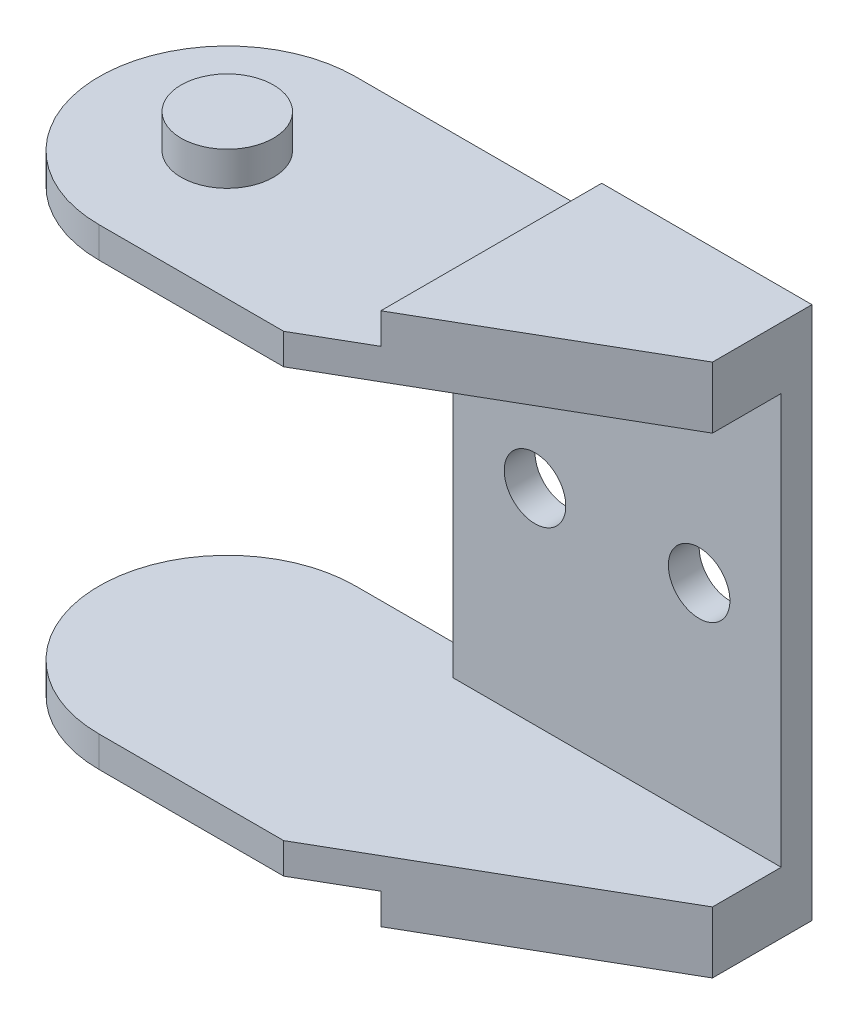
ISO-10303-21;
HEADER;
FILE_DESCRIPTION(('STEP AP214'),'2;1');
FILE_NAME('part.step','',(''),(''),'','','');
FILE_SCHEMA(('AUTOMOTIVE_DESIGN { 1 0 10303 214 1 1 1 1 }'));
ENDSEC;
DATA;
#1=APPLICATION_CONTEXT('core data for automotive mechanical design processes');
#2=APPLICATION_PROTOCOL_DEFINITION('international standard','automotive_design',2000,#1);
#3=PRODUCT_CONTEXT('',#1,'mechanical');
#4=PRODUCT('Part','Part','',(#3));
#5=PRODUCT_RELATED_PRODUCT_CATEGORY('part','',(#4));
#6=PRODUCT_DEFINITION_FORMATION('','',#4);
#7=PRODUCT_DEFINITION_CONTEXT('part definition',#1,'design');
#8=PRODUCT_DEFINITION('design','',#6,#7);
#9=PRODUCT_DEFINITION_SHAPE('','',#8);
#10=(LENGTH_UNIT() NAMED_UNIT(*) SI_UNIT(.MILLI.,.METRE.));
#11=(NAMED_UNIT(*) PLANE_ANGLE_UNIT() SI_UNIT($,.RADIAN.));
#12=(NAMED_UNIT(*) SI_UNIT($,.STERADIAN.) SOLID_ANGLE_UNIT());
#13=UNCERTAINTY_MEASURE_WITH_UNIT(LENGTH_MEASURE(1.E-05),#10,'distance_accuracy_value','');
#14=(GEOMETRIC_REPRESENTATION_CONTEXT(3) GLOBAL_UNCERTAINTY_ASSIGNED_CONTEXT((#13)) GLOBAL_UNIT_ASSIGNED_CONTEXT((#10,
#11,#12)) REPRESENTATION_CONTEXT('',''));
#15=CARTESIAN_POINT('',(0.,0.,0.));
#16=DIRECTION('',(0.,0.,1.));
#17=DIRECTION('',(1.,0.,0.));
#18=AXIS2_PLACEMENT_3D('',#15,#16,#17);
#19=CARTESIAN_POINT('',(0.,-13.,6.25));
#20=DIRECTION('',(0.,0.,1.));
#21=DIRECTION('',(1.,0.,0.));
#22=AXIS2_PLACEMENT_3D('',#19,#20,#21);
#23=PLANE('',#22);
#24=DIRECTION('',(0.,1.,0.));
#25=VECTOR('',#24,1.);
#26=CARTESIAN_POINT('',(0.,-13.,6.25));
#27=LINE('',#26,#25);
#28=CARTESIAN_POINT('',(0.,-11.5,6.25));
#29=VERTEX_POINT('',#28);
#30=CARTESIAN_POINT('',(0.,-10.,6.25));
#31=VERTEX_POINT('',#30);
#32=EDGE_CURVE('E242',#29,#31,#27,.T.);
#33=ORIENTED_EDGE('',*,*,#32,.F.);
#34=DIRECTION('',(1.,0.,0.));
#35=VECTOR('',#34,1.);
#36=CARTESIAN_POINT('',(-6.25,-11.5,6.25));
#37=LINE('',#36,#35);
#38=CARTESIAN_POINT('',(8.99999999999999,-11.5,6.25));
#39=VERTEX_POINT('',#38);
#40=EDGE_CURVE('E150',#29,#39,#37,.T.);
#41=ORIENTED_EDGE('',*,*,#40,.T.);
#42=DIRECTION('',(0.,1.,0.));
#43=VECTOR('',#42,1.);
#44=CARTESIAN_POINT('',(9.00000000000001,-13.,6.24999999999999));
#45=LINE('',#44,#43);
#46=CARTESIAN_POINT('',(8.99999999999999,-10.,6.25));
#47=VERTEX_POINT('',#46);
#48=EDGE_CURVE('E255',#39,#47,#45,.T.);
#49=ORIENTED_EDGE('',*,*,#48,.T.);
#50=DIRECTION('',(1.,0.,0.));
#51=VECTOR('',#50,1.);
#52=CARTESIAN_POINT('',(-6.25,-10.,6.25));
#53=LINE('',#52,#51);
#54=EDGE_CURVE('E197',#31,#47,#53,.T.);
#55=ORIENTED_EDGE('',*,*,#54,.F.);
#56=EDGE_LOOP('',(#33,#41,#49,#55));
#57=FACE_BOUND('',#56,.T.);
#58=ADVANCED_FACE('F32',(#57),#23,.T.);
#59=CARTESIAN_POINT('',(0.,-13.,0.));
#60=DIRECTION('',(0.,1.,0.));
#61=DIRECTION('',(0.,0.,1.));
#62=AXIS2_PLACEMENT_3D('',#59,#60,#61);
#63=CYLINDRICAL_SURFACE('',#62,6.25);
#64=DIRECTION('',(0.,1.,0.));
#65=VECTOR('',#64,1.);
#66=CARTESIAN_POINT('',(0.,-13.,-6.25));
#67=LINE('',#66,#65);
#68=CARTESIAN_POINT('',(0.,-11.5,-6.25));
#69=VERTEX_POINT('',#68);
#70=CARTESIAN_POINT('',(0.,-10.,-6.25));
#71=VERTEX_POINT('',#70);
#72=EDGE_CURVE('E246',#69,#71,#67,.T.);
#73=ORIENTED_EDGE('',*,*,#72,.F.);
#74=CARTESIAN_POINT('',(0.,-11.5,0.));
#75=DIRECTION('',(0.,-1.,0.));
#76=DIRECTION('',(0.,0.,-1.));
#77=AXIS2_PLACEMENT_3D('',#74,#75,#76);
#78=CIRCLE('',#77,6.25);
#79=EDGE_CURVE('E157',#69,#29,#78,.F.);
#80=ORIENTED_EDGE('',*,*,#79,.T.);
#81=ORIENTED_EDGE('',*,*,#32,.T.);
#82=CARTESIAN_POINT('',(0.,-10.,0.));
#83=DIRECTION('',(0.,-1.,0.));
#84=DIRECTION('',(0.,0.,-1.));
#85=AXIS2_PLACEMENT_3D('',#82,#83,#84);
#86=CIRCLE('',#85,6.25);
#87=EDGE_CURVE('E224',#71,#31,#86,.F.);
#88=ORIENTED_EDGE('',*,*,#87,.F.);
#89=EDGE_LOOP('',(#73,#80,#81,#88));
#90=FACE_BOUND('',#89,.T.);
#91=ADVANCED_FACE('F300',(#90),#63,.T.);
#92=CARTESIAN_POINT('',(22.25,-13.,-6.25));
#93=DIRECTION('',(0.,0.,-1.));
#94=DIRECTION('',(-1.,0.,0.));
#95=AXIS2_PLACEMENT_3D('',#92,#93,#94);
#96=PLANE('',#95);
#97=CARTESIAN_POINT('',(10.25,0.,-6.25));
#98=DIRECTION('',(0.,0.,-1.));
#99=DIRECTION('',(-1.,0.,0.));
#100=AXIS2_PLACEMENT_3D('',#97,#98,#99);
#101=CIRCLE('',#100,1.49999999999999);
#102=CARTESIAN_POINT('',(8.75000000000002,0.,-6.25));
#103=VERTEX_POINT('',#102);
#104=EDGE_CURVE('E291',#103,#103,#101,.T.);
#105=ORIENTED_EDGE('',*,*,#104,.F.);
#106=EDGE_LOOP('',(#105));
#107=FACE_BOUND('',#106,.T.);
#108=CARTESIAN_POINT('',(18.25,0.,-6.25));
#109=DIRECTION('',(0.,0.,-1.));
#110=DIRECTION('',(-1.,0.,0.));
#111=AXIS2_PLACEMENT_3D('',#108,#109,#110);
#112=CIRCLE('',#111,1.49999999999999);
#113=CARTESIAN_POINT('',(16.75,0.,-6.25));
#114=VERTEX_POINT('',#113);
#115=EDGE_CURVE('E285',#114,#114,#112,.T.);
#116=ORIENTED_EDGE('',*,*,#115,.F.);
#117=EDGE_LOOP('',(#116));
#118=FACE_BOUND('',#117,.T.);
#119=DIRECTION('',(-1.,0.,0.));
#120=VECTOR('',#119,1.);
#121=CARTESIAN_POINT('',(22.25,-13.,-6.25));
#122=LINE('',#121,#120);
#123=CARTESIAN_POINT('',(22.25,-13.,-6.25));
#124=VERTEX_POINT('',#123);
#125=CARTESIAN_POINT('',(12.,-13.,-6.25));
#126=VERTEX_POINT('',#125);
#127=EDGE_CURVE('E164',#124,#126,#122,.T.);
#128=ORIENTED_EDGE('',*,*,#127,.T.);
#129=DIRECTION('',(0.,-1.,0.));
#130=VECTOR('',#129,1.);
#131=CARTESIAN_POINT('',(12.,-11.5,-6.25));
#132=LINE('',#131,#130);
#133=CARTESIAN_POINT('',(12.,-11.5,-6.25));
#134=VERTEX_POINT('',#133);
#135=EDGE_CURVE('E46',#134,#126,#132,.T.);
#136=ORIENTED_EDGE('',*,*,#135,.F.);
#137=DIRECTION('',(-1.,0.,0.));
#138=VECTOR('',#137,1.);
#139=CARTESIAN_POINT('',(12.,-11.5,-6.25));
#140=LINE('',#139,#138);
#141=EDGE_CURVE('E154',#134,#69,#140,.T.);
#142=ORIENTED_EDGE('',*,*,#141,.T.);
#143=ORIENTED_EDGE('',*,*,#72,.T.);
#144=DIRECTION('',(-1.,0.,0.));
#145=VECTOR('',#144,1.);
#146=CARTESIAN_POINT('',(6.25,-10.,-6.25));
#147=LINE('',#146,#145);
#148=CARTESIAN_POINT('',(6.25,-10.,-6.25));
#149=VERTEX_POINT('',#148);
#150=EDGE_CURVE('E194',#149,#71,#147,.T.);
#151=ORIENTED_EDGE('',*,*,#150,.F.);
#152=DIRECTION('',(0.,1.,0.));
#153=VECTOR('',#152,1.);
#154=CARTESIAN_POINT('',(6.25,-10.,-6.25));
#155=LINE('',#154,#153);
#156=CARTESIAN_POINT('',(6.25,10.,-6.25));
#157=VERTEX_POINT('',#156);
#158=EDGE_CURVE('E219',#149,#157,#155,.T.);
#159=ORIENTED_EDGE('',*,*,#158,.T.);
#160=DIRECTION('',(-1.,0.,0.));
#161=VECTOR('',#160,1.);
#162=CARTESIAN_POINT('',(6.25,10.,-6.25));
#163=LINE('',#162,#161);
#164=CARTESIAN_POINT('',(0.,10.,-6.25));
#165=VERTEX_POINT('',#164);
#166=EDGE_CURVE('E208',#157,#165,#163,.T.);
#167=ORIENTED_EDGE('',*,*,#166,.T.);
#168=CARTESIAN_POINT('',(0.,11.5,-6.25));
#169=VERTEX_POINT('',#168);
#170=EDGE_CURVE('E248',#165,#169,#67,.T.);
#171=ORIENTED_EDGE('',*,*,#170,.T.);
#172=DIRECTION('',(-1.,0.,0.));
#173=VECTOR('',#172,1.);
#174=CARTESIAN_POINT('',(12.,11.5,-6.25));
#175=LINE('',#174,#173);
#176=CARTESIAN_POINT('',(12.,11.5,-6.25));
#177=VERTEX_POINT('',#176);
#178=EDGE_CURVE('E172',#177,#169,#175,.T.);
#179=ORIENTED_EDGE('',*,*,#178,.F.);
#180=DIRECTION('',(0.,1.,0.));
#181=VECTOR('',#180,1.);
#182=CARTESIAN_POINT('',(12.,11.5,-6.25));
#183=LINE('',#182,#181);
#184=CARTESIAN_POINT('',(12.,13.,-6.25));
#185=VERTEX_POINT('',#184);
#186=EDGE_CURVE('E177',#177,#185,#183,.T.);
#187=ORIENTED_EDGE('',*,*,#186,.T.);
#188=DIRECTION('',(-1.,0.,0.));
#189=VECTOR('',#188,1.);
#190=CARTESIAN_POINT('',(22.25,13.,-6.25));
#191=LINE('',#190,#189);
#192=CARTESIAN_POINT('',(22.25,13.,-6.25));
#193=VERTEX_POINT('',#192);
#194=EDGE_CURVE('E231',#193,#185,#191,.T.);
#195=ORIENTED_EDGE('',*,*,#194,.F.);
#196=DIRECTION('',(0.,1.,0.));
#197=VECTOR('',#196,1.);
#198=CARTESIAN_POINT('',(22.25,-13.,-6.25));
#199=LINE('',#198,#197);
#200=EDGE_CURVE('E249',#124,#193,#199,.T.);
#201=ORIENTED_EDGE('',*,*,#200,.F.);
#202=EDGE_LOOP('',(#128,#136,#142,#143,#151,#159,#167,#171,#179,#187,#195,#201));
#203=FACE_BOUND('',#202,.T.);
#204=ADVANCED_FACE('F162',(#107,#118,#203),#96,.T.);
#205=CARTESIAN_POINT('',(9.00000000000001,-13.,6.24999999999999));
#206=DIRECTION('',(0.5,0.,0.866025403784439));
#207=DIRECTION('',(0.866025403784439,0.,-0.5));
#208=AXIS2_PLACEMENT_3D('',#205,#206,#207);
#209=PLANE('',#208);
#210=DIRECTION('',(0.866025403784439,0.,-0.5));
#211=VECTOR('',#210,1.);
#212=CARTESIAN_POINT('',(9.00000000000001,-11.5,6.24999999999999));
#213=LINE('',#212,#211);
#214=CARTESIAN_POINT('',(12.,-11.5,4.51794919243112));
#215=VERTEX_POINT('',#214);
#216=EDGE_CURVE('E39',#39,#215,#213,.T.);
#217=ORIENTED_EDGE('',*,*,#216,.T.);
#218=DIRECTION('',(0.,-1.,0.));
#219=VECTOR('',#218,1.);
#220=CARTESIAN_POINT('',(12.,-13.,4.51794919243112));
#221=LINE('',#220,#219);
#222=CARTESIAN_POINT('',(12.,-13.,4.51794919243112));
#223=VERTEX_POINT('',#222);
#224=EDGE_CURVE('E147',#215,#223,#221,.T.);
#225=ORIENTED_EDGE('',*,*,#224,.T.);
#226=DIRECTION('',(0.866025403784439,0.,-0.5));
#227=VECTOR('',#226,1.);
#228=CARTESIAN_POINT('',(9.00000000000001,-13.,6.24999999999999));
#229=LINE('',#228,#227);
#230=CARTESIAN_POINT('',(22.25,-13.,-1.39989106676254));
#231=VERTEX_POINT('',#230);
#232=EDGE_CURVE('E228',#223,#231,#229,.T.);
#233=ORIENTED_EDGE('',*,*,#232,.T.);
#234=DIRECTION('',(0.,1.,0.));
#235=VECTOR('',#234,1.);
#236=CARTESIAN_POINT('',(22.25,-13.,-1.39989106676254));
#237=LINE('',#236,#235);
#238=CARTESIAN_POINT('',(22.25,-10.,-1.39989106676254));
#239=VERTEX_POINT('',#238);
#240=EDGE_CURVE('E251',#231,#239,#237,.T.);
#241=ORIENTED_EDGE('',*,*,#240,.T.);
#242=DIRECTION('',(0.866025403784439,0.,-0.5));
#243=VECTOR('',#242,1.);
#244=CARTESIAN_POINT('',(9.00000000000001,-10.,6.24999999999999));
#245=LINE('',#244,#243);
#246=EDGE_CURVE('E259',#47,#239,#245,.T.);
#247=ORIENTED_EDGE('',*,*,#246,.F.);
#248=ORIENTED_EDGE('',*,*,#48,.F.);
#249=EDGE_LOOP('',(#217,#225,#233,#241,#247,#248));
#250=FACE_BOUND('',#249,.T.);
#251=ADVANCED_FACE('F266',(#250),#209,.T.);
#252=CARTESIAN_POINT('',(0.,-13.,0.));
#253=DIRECTION('',(0.,1.,0.));
#254=DIRECTION('',(0.,0.,1.));
#255=AXIS2_PLACEMENT_3D('',#252,#253,#254);
#256=PLANE('',#255);
#257=DIRECTION('',(0.,0.,1.));
#258=VECTOR('',#257,1.);
#259=CARTESIAN_POINT('',(12.,-13.,0.));
#260=LINE('',#259,#258);
#261=EDGE_CURVE('E263',#126,#223,#260,.T.);
#262=ORIENTED_EDGE('',*,*,#261,.F.);
#263=ORIENTED_EDGE('',*,*,#127,.F.);
#264=DIRECTION('',(0.,0.,-1.));
#265=VECTOR('',#264,1.);
#266=CARTESIAN_POINT('',(22.25,-13.,-1.39989106676254));
#267=LINE('',#266,#265);
#268=EDGE_CURVE('E230',#231,#124,#267,.T.);
#269=ORIENTED_EDGE('',*,*,#268,.F.);
#270=ORIENTED_EDGE('',*,*,#232,.F.);
#271=EDGE_LOOP('',(#262,#263,#269,#270));
#272=FACE_BOUND('',#271,.T.);
#273=ADVANCED_FACE('F355',(#272),#256,.F.);
#274=CARTESIAN_POINT('',(8.99999999999999,10.,6.25));
#275=VERTEX_POINT('',#274);
#276=CARTESIAN_POINT('',(8.99999999999999,11.5,6.25));
#277=VERTEX_POINT('',#276);
#278=EDGE_CURVE('E235',#275,#277,#45,.T.);
#279=ORIENTED_EDGE('',*,*,#278,.T.);
#280=DIRECTION('',(1.,0.,0.));
#281=VECTOR('',#280,1.);
#282=CARTESIAN_POINT('',(-6.25,11.5,6.25));
#283=LINE('',#282,#281);
#284=CARTESIAN_POINT('',(0.,11.5,6.25));
#285=VERTEX_POINT('',#284);
#286=EDGE_CURVE('E175',#285,#277,#283,.T.);
#287=ORIENTED_EDGE('',*,*,#286,.F.);
#288=CARTESIAN_POINT('',(0.,10.,6.25));
#289=VERTEX_POINT('',#288);
#290=EDGE_CURVE('E245',#289,#285,#27,.T.);
#291=ORIENTED_EDGE('',*,*,#290,.F.);
#292=DIRECTION('',(1.,0.,0.));
#293=VECTOR('',#292,1.);
#294=CARTESIAN_POINT('',(-6.25,10.,6.25));
#295=LINE('',#294,#293);
#296=EDGE_CURVE('E211',#289,#275,#295,.T.);
#297=ORIENTED_EDGE('',*,*,#296,.T.);
#298=EDGE_LOOP('',(#279,#287,#291,#297));
#299=FACE_BOUND('',#298,.T.);
#300=ADVANCED_FACE('F339',(#299),#23,.T.);
#301=ORIENTED_EDGE('',*,*,#290,.T.);
#302=CARTESIAN_POINT('',(0.,11.5,0.));
#303=DIRECTION('',(0.,1.,0.));
#304=DIRECTION('',(0.,0.,1.));
#305=AXIS2_PLACEMENT_3D('',#302,#303,#304);
#306=CIRCLE('',#305,6.25);
#307=EDGE_CURVE('E184',#285,#169,#306,.F.);
#308=ORIENTED_EDGE('',*,*,#307,.T.);
#309=ORIENTED_EDGE('',*,*,#170,.F.);
#310=CARTESIAN_POINT('',(0.,10.,0.));
#311=DIRECTION('',(0.,-1.,0.));
#312=DIRECTION('',(0.,0.,-1.));
#313=AXIS2_PLACEMENT_3D('',#310,#311,#312);
#314=CIRCLE('',#313,6.25);
#315=EDGE_CURVE('E218',#165,#289,#314,.F.);
#316=ORIENTED_EDGE('',*,*,#315,.T.);
#317=EDGE_LOOP('',(#301,#308,#309,#316));
#318=FACE_BOUND('',#317,.T.);
#319=ADVANCED_FACE('F343',(#318),#63,.T.);
#320=DIRECTION('',(0.,1.,0.));
#321=VECTOR('',#320,1.);
#322=CARTESIAN_POINT('',(12.,-13.,4.51794919243112));
#323=LINE('',#322,#321);
#324=CARTESIAN_POINT('',(12.,11.5,4.51794919243112));
#325=VERTEX_POINT('',#324);
#326=CARTESIAN_POINT('',(12.,13.,4.51794919243112));
#327=VERTEX_POINT('',#326);
#328=EDGE_CURVE('E54',#325,#327,#323,.T.);
#329=ORIENTED_EDGE('',*,*,#328,.F.);
#330=DIRECTION('',(-0.866025403784439,0.,0.5));
#331=VECTOR('',#330,1.);
#332=CARTESIAN_POINT('',(9.00000000000001,11.5,6.24999999999999));
#333=LINE('',#332,#331);
#334=EDGE_CURVE('E181',#325,#277,#333,.T.);
#335=ORIENTED_EDGE('',*,*,#334,.T.);
#336=ORIENTED_EDGE('',*,*,#278,.F.);
#337=DIRECTION('',(0.866025403784439,0.,-0.5));
#338=VECTOR('',#337,1.);
#339=CARTESIAN_POINT('',(9.00000000000001,10.,6.24999999999999));
#340=LINE('',#339,#338);
#341=CARTESIAN_POINT('',(22.25,10.,-1.39989106676254));
#342=VERTEX_POINT('',#341);
#343=EDGE_CURVE('E244',#275,#342,#340,.T.);
#344=ORIENTED_EDGE('',*,*,#343,.T.);
#345=CARTESIAN_POINT('',(22.25,13.,-1.39989106676254));
#346=VERTEX_POINT('',#345);
#347=EDGE_CURVE('E254',#342,#346,#237,.T.);
#348=ORIENTED_EDGE('',*,*,#347,.T.);
#349=DIRECTION('',(0.866025403784439,0.,-0.5));
#350=VECTOR('',#349,1.);
#351=CARTESIAN_POINT('',(9.00000000000001,13.,6.24999999999999));
#352=LINE('',#351,#350);
#353=EDGE_CURVE('E227',#327,#346,#352,.T.);
#354=ORIENTED_EDGE('',*,*,#353,.F.);
#355=EDGE_LOOP('',(#329,#335,#336,#344,#348,#354));
#356=FACE_BOUND('',#355,.T.);
#357=ADVANCED_FACE('F333',(#356),#209,.T.);
#358=CARTESIAN_POINT('',(22.25,-13.,-1.39989106676254));
#359=DIRECTION('',(1.,0.,0.));
#360=DIRECTION('',(0.,0.,-1.));
#361=AXIS2_PLACEMENT_3D('',#358,#359,#360);
#362=PLANE('',#361);
#363=DIRECTION('',(0.,0.,-1.));
#364=VECTOR('',#363,1.);
#365=CARTESIAN_POINT('',(22.25,-10.,6.25));
#366=LINE('',#365,#364);
#367=CARTESIAN_POINT('',(22.25,-10.,-4.75));
#368=VERTEX_POINT('',#367);
#369=EDGE_CURVE('E200',#239,#368,#366,.T.);
#370=ORIENTED_EDGE('',*,*,#369,.F.);
#371=ORIENTED_EDGE('',*,*,#240,.F.);
#372=ORIENTED_EDGE('',*,*,#268,.T.);
#373=ORIENTED_EDGE('',*,*,#200,.T.);
#374=DIRECTION('',(0.,0.,-1.));
#375=VECTOR('',#374,1.);
#376=CARTESIAN_POINT('',(22.25,13.,-1.39989106676254));
#377=LINE('',#376,#375);
#378=EDGE_CURVE('E237',#346,#193,#377,.T.);
#379=ORIENTED_EDGE('',*,*,#378,.F.);
#380=ORIENTED_EDGE('',*,*,#347,.F.);
#381=DIRECTION('',(0.,0.,-1.));
#382=VECTOR('',#381,1.);
#383=CARTESIAN_POINT('',(22.25,10.,6.25));
#384=LINE('',#383,#382);
#385=CARTESIAN_POINT('',(22.25,10.,-4.75));
#386=VERTEX_POINT('',#385);
#387=EDGE_CURVE('E191',#342,#386,#384,.T.);
#388=ORIENTED_EDGE('',*,*,#387,.T.);
#389=DIRECTION('',(0.,1.,0.));
#390=VECTOR('',#389,1.);
#391=CARTESIAN_POINT('',(22.25,-10.,-4.75));
#392=LINE('',#391,#390);
#393=EDGE_CURVE('E216',#368,#386,#392,.T.);
#394=ORIENTED_EDGE('',*,*,#393,.F.);
#395=EDGE_LOOP('',(#370,#371,#372,#373,#379,#380,#388,#394));
#396=FACE_BOUND('',#395,.T.);
#397=ADVANCED_FACE('F328',(#396),#362,.T.);
#398=CARTESIAN_POINT('',(0.,13.,0.));
#399=DIRECTION('',(0.,1.,0.));
#400=DIRECTION('',(0.,0.,1.));
#401=AXIS2_PLACEMENT_3D('',#398,#399,#400);
#402=PLANE('',#401);
#403=DIRECTION('',(0.,0.,-1.));
#404=VECTOR('',#403,1.);
#405=CARTESIAN_POINT('',(12.,13.,0.));
#406=LINE('',#405,#404);
#407=EDGE_CURVE('E261',#327,#185,#406,.T.);
#408=ORIENTED_EDGE('',*,*,#407,.F.);
#409=ORIENTED_EDGE('',*,*,#353,.T.);
#410=ORIENTED_EDGE('',*,*,#378,.T.);
#411=ORIENTED_EDGE('',*,*,#194,.T.);
#412=EDGE_LOOP('',(#408,#409,#410,#411));
#413=FACE_BOUND('',#412,.T.);
#414=ADVANCED_FACE('F315',(#413),#402,.T.);
#415=CARTESIAN_POINT('',(22.25,-10.,-4.75));
#416=DIRECTION('',(0.,0.,-1.));
#417=DIRECTION('',(-1.,0.,0.));
#418=AXIS2_PLACEMENT_3D('',#415,#416,#417);
#419=PLANE('',#418);
#420=CARTESIAN_POINT('',(10.25,0.,-4.75));
#421=DIRECTION('',(0.,0.,-1.));
#422=DIRECTION('',(-1.,0.,0.));
#423=AXIS2_PLACEMENT_3D('',#420,#421,#422);
#424=CIRCLE('',#423,1.49999999999999);
#425=CARTESIAN_POINT('',(8.75000000000002,0.,-4.75));
#426=VERTEX_POINT('',#425);
#427=EDGE_CURVE('E288',#426,#426,#424,.T.);
#428=ORIENTED_EDGE('',*,*,#427,.T.);
#429=EDGE_LOOP('',(#428));
#430=FACE_BOUND('',#429,.T.);
#431=CARTESIAN_POINT('',(18.25,0.,-4.75));
#432=DIRECTION('',(0.,0.,-1.));
#433=DIRECTION('',(-1.,0.,0.));
#434=AXIS2_PLACEMENT_3D('',#431,#432,#433);
#435=CIRCLE('',#434,1.49999999999999);
#436=CARTESIAN_POINT('',(16.75,0.,-4.75));
#437=VERTEX_POINT('',#436);
#438=EDGE_CURVE('E282',#437,#437,#435,.T.);
#439=ORIENTED_EDGE('',*,*,#438,.T.);
#440=EDGE_LOOP('',(#439));
#441=FACE_BOUND('',#440,.T.);
#442=DIRECTION('',(-1.,0.,0.));
#443=VECTOR('',#442,1.);
#444=CARTESIAN_POINT('',(22.25,10.,-4.75));
#445=LINE('',#444,#443);
#446=CARTESIAN_POINT('',(6.25,10.,-4.75));
#447=VERTEX_POINT('',#446);
#448=EDGE_CURVE('E186',#386,#447,#445,.T.);
#449=ORIENTED_EDGE('',*,*,#448,.T.);
#450=DIRECTION('',(0.,1.,0.));
#451=VECTOR('',#450,1.);
#452=CARTESIAN_POINT('',(6.25,-10.,-4.75));
#453=LINE('',#452,#451);
#454=CARTESIAN_POINT('',(6.25,-10.,-4.75));
#455=VERTEX_POINT('',#454);
#456=EDGE_CURVE('E202',#455,#447,#453,.T.);
#457=ORIENTED_EDGE('',*,*,#456,.F.);
#458=DIRECTION('',(-1.,0.,0.));
#459=VECTOR('',#458,1.);
#460=CARTESIAN_POINT('',(22.25,-10.,-4.75));
#461=LINE('',#460,#459);
#462=EDGE_CURVE('E187',#368,#455,#461,.T.);
#463=ORIENTED_EDGE('',*,*,#462,.F.);
#464=ORIENTED_EDGE('',*,*,#393,.T.);
#465=EDGE_LOOP('',(#449,#457,#463,#464));
#466=FACE_BOUND('',#465,.T.);
#467=ADVANCED_FACE('F311',(#430,#441,#466),#419,.F.);
#468=CARTESIAN_POINT('',(6.25,-10.,-4.75));
#469=DIRECTION('',(1.,0.,0.));
#470=DIRECTION('',(0.,0.,-1.));
#471=AXIS2_PLACEMENT_3D('',#468,#469,#470);
#472=PLANE('',#471);
#473=DIRECTION('',(0.,0.,-1.));
#474=VECTOR('',#473,1.);
#475=CARTESIAN_POINT('',(6.25,10.,-4.75));
#476=LINE('',#475,#474);
#477=EDGE_CURVE('E205',#447,#157,#476,.T.);
#478=ORIENTED_EDGE('',*,*,#477,.T.);
#479=ORIENTED_EDGE('',*,*,#158,.F.);
#480=DIRECTION('',(0.,0.,-1.));
#481=VECTOR('',#480,1.);
#482=CARTESIAN_POINT('',(6.25,-10.,-4.75));
#483=LINE('',#482,#481);
#484=EDGE_CURVE('E190',#455,#149,#483,.T.);
#485=ORIENTED_EDGE('',*,*,#484,.F.);
#486=ORIENTED_EDGE('',*,*,#456,.T.);
#487=EDGE_LOOP('',(#478,#479,#485,#486));
#488=FACE_BOUND('',#487,.T.);
#489=ADVANCED_FACE('F314',(#488),#472,.F.);
#490=CARTESIAN_POINT('',(0.,-10.,0.));
#491=DIRECTION('',(0.,-1.,0.));
#492=DIRECTION('',(0.,0.,-1.));
#493=AXIS2_PLACEMENT_3D('',#490,#491,#492);
#494=PLANE('',#493);
#495=ORIENTED_EDGE('',*,*,#87,.T.);
#496=ORIENTED_EDGE('',*,*,#54,.T.);
#497=ORIENTED_EDGE('',*,*,#246,.T.);
#498=ORIENTED_EDGE('',*,*,#369,.T.);
#499=ORIENTED_EDGE('',*,*,#462,.T.);
#500=ORIENTED_EDGE('',*,*,#484,.T.);
#501=ORIENTED_EDGE('',*,*,#150,.T.);
#502=EDGE_LOOP('',(#495,#496,#497,#498,#499,#500,#501));
#503=FACE_BOUND('',#502,.T.);
#504=ADVANCED_FACE('F350',(#503),#494,.F.);
#505=CARTESIAN_POINT('',(0.,10.,0.));
#506=DIRECTION('',(0.,-1.,0.));
#507=DIRECTION('',(0.,0.,-1.));
#508=AXIS2_PLACEMENT_3D('',#505,#506,#507);
#509=PLANE('',#508);
#510=ORIENTED_EDGE('',*,*,#166,.F.);
#511=ORIENTED_EDGE('',*,*,#477,.F.);
#512=ORIENTED_EDGE('',*,*,#448,.F.);
#513=ORIENTED_EDGE('',*,*,#387,.F.);
#514=ORIENTED_EDGE('',*,*,#343,.F.);
#515=ORIENTED_EDGE('',*,*,#296,.F.);
#516=ORIENTED_EDGE('',*,*,#315,.F.);
#517=EDGE_LOOP('',(#510,#511,#512,#513,#514,#515,#516));
#518=FACE_BOUND('',#517,.T.);
#519=ADVANCED_FACE('F324',(#518),#509,.T.);
#520=CARTESIAN_POINT('',(12.,11.5,6.25));
#521=DIRECTION('',(1.,0.,0.));
#522=DIRECTION('',(0.,0.,-1.));
#523=AXIS2_PLACEMENT_3D('',#520,#521,#522);
#524=PLANE('',#523);
#525=ORIENTED_EDGE('',*,*,#328,.T.);
#526=ORIENTED_EDGE('',*,*,#407,.T.);
#527=ORIENTED_EDGE('',*,*,#186,.F.);
#528=DIRECTION('',(0.,0.,-1.));
#529=VECTOR('',#528,1.);
#530=CARTESIAN_POINT('',(12.,11.5,6.25));
#531=LINE('',#530,#529);
#532=EDGE_CURVE('E170',#325,#177,#531,.T.);
#533=ORIENTED_EDGE('',*,*,#532,.F.);
#534=EDGE_LOOP('',(#525,#526,#527,#533));
#535=FACE_BOUND('',#534,.T.);
#536=ADVANCED_FACE('F359',(#535),#524,.F.);
#537=CARTESIAN_POINT('',(0.,11.5,0.));
#538=DIRECTION('',(0.,1.,0.));
#539=DIRECTION('',(0.,0.,1.));
#540=AXIS2_PLACEMENT_3D('',#537,#538,#539);
#541=PLANE('',#540);
#542=CARTESIAN_POINT('',(0.,11.5,0.));
#543=DIRECTION('',(0.,1.,0.));
#544=DIRECTION('',(0.,0.,1.));
#545=AXIS2_PLACEMENT_3D('',#542,#543,#544);
#546=CIRCLE('',#545,2.25);
#547=CARTESIAN_POINT('',(0.,11.5,2.25));
#548=VERTEX_POINT('',#547);
#549=EDGE_CURVE('E274',#548,#548,#546,.T.);
#550=ORIENTED_EDGE('',*,*,#549,.F.);
#551=EDGE_LOOP('',(#550));
#552=FACE_BOUND('',#551,.T.);
#553=ORIENTED_EDGE('',*,*,#286,.T.);
#554=ORIENTED_EDGE('',*,*,#334,.F.);
#555=ORIENTED_EDGE('',*,*,#532,.T.);
#556=ORIENTED_EDGE('',*,*,#178,.T.);
#557=ORIENTED_EDGE('',*,*,#307,.F.);
#558=EDGE_LOOP('',(#553,#554,#555,#556,#557));
#559=FACE_BOUND('',#558,.T.);
#560=ADVANCED_FACE('F361',(#552,#559),#541,.T.);
#561=CARTESIAN_POINT('',(12.,-11.5,6.25));
#562=DIRECTION('',(-1.,0.,0.));
#563=DIRECTION('',(0.,0.,1.));
#564=AXIS2_PLACEMENT_3D('',#561,#562,#563);
#565=PLANE('',#564);
#566=DIRECTION('',(0.,0.,-1.));
#567=VECTOR('',#566,1.);
#568=CARTESIAN_POINT('',(12.,-11.5,6.25));
#569=LINE('',#568,#567);
#570=EDGE_CURVE('E143',#215,#134,#569,.T.);
#571=ORIENTED_EDGE('',*,*,#570,.T.);
#572=ORIENTED_EDGE('',*,*,#135,.T.);
#573=ORIENTED_EDGE('',*,*,#261,.T.);
#574=ORIENTED_EDGE('',*,*,#224,.F.);
#575=EDGE_LOOP('',(#571,#572,#573,#574));
#576=FACE_BOUND('',#575,.T.);
#577=ADVANCED_FACE('F145',(#576),#565,.T.);
#578=CARTESIAN_POINT('',(0.,-11.5,0.));
#579=DIRECTION('',(0.,-1.,0.));
#580=DIRECTION('',(0.,0.,1.));
#581=AXIS2_PLACEMENT_3D('',#578,#579,#580);
#582=PLANE('',#581);
#583=CARTESIAN_POINT('',(0.,-11.5,0.));
#584=DIRECTION('',(0.,-1.,0.));
#585=DIRECTION('',(0.,0.,-1.));
#586=AXIS2_PLACEMENT_3D('',#583,#584,#585);
#587=CIRCLE('',#586,2.25);
#588=CARTESIAN_POINT('',(0.,-11.5,-2.25));
#589=VERTEX_POINT('',#588);
#590=EDGE_CURVE('E11',#589,#589,#587,.T.);
#591=ORIENTED_EDGE('',*,*,#590,.F.);
#592=EDGE_LOOP('',(#591));
#593=FACE_BOUND('',#592,.T.);
#594=ORIENTED_EDGE('',*,*,#141,.F.);
#595=ORIENTED_EDGE('',*,*,#570,.F.);
#596=ORIENTED_EDGE('',*,*,#216,.F.);
#597=ORIENTED_EDGE('',*,*,#40,.F.);
#598=ORIENTED_EDGE('',*,*,#79,.F.);
#599=EDGE_LOOP('',(#594,#595,#596,#597,#598));
#600=FACE_BOUND('',#599,.T.);
#601=ADVANCED_FACE('F155',(#593,#600),#582,.T.);
#602=CARTESIAN_POINT('',(0.,13.15,0.));
#603=DIRECTION('',(0.,-1.,0.));
#604=DIRECTION('',(0.,0.,-1.));
#605=AXIS2_PLACEMENT_3D('',#602,#603,#604);
#606=CYLINDRICAL_SURFACE('',#605,2.25);
#607=CARTESIAN_POINT('',(0.,13.15,0.));
#608=DIRECTION('',(0.,1.,0.));
#609=DIRECTION('',(0.,0.,1.));
#610=AXIS2_PLACEMENT_3D('',#607,#608,#609);
#611=CIRCLE('',#610,2.25);
#612=CARTESIAN_POINT('',(0.,13.15,2.25));
#613=VERTEX_POINT('',#612);
#614=EDGE_CURVE('E151',#613,#613,#611,.T.);
#615=ORIENTED_EDGE('',*,*,#614,.F.);
#616=EDGE_LOOP('',(#615));
#617=FACE_BOUND('',#616,.T.);
#618=ORIENTED_EDGE('',*,*,#549,.T.);
#619=EDGE_LOOP('',(#618));
#620=FACE_BOUND('',#619,.T.);
#621=ADVANCED_FACE('F481',(#617,#620),#606,.T.);
#622=CARTESIAN_POINT('',(0.,13.15,0.));
#623=DIRECTION('',(0.,1.,0.));
#624=DIRECTION('',(0.,0.,1.));
#625=AXIS2_PLACEMENT_3D('',#622,#623,#624);
#626=PLANE('',#625);
#627=ORIENTED_EDGE('',*,*,#614,.T.);
#628=EDGE_LOOP('',(#627));
#629=FACE_BOUND('',#628,.T.);
#630=ADVANCED_FACE('F477',(#629),#626,.T.);
#631=CARTESIAN_POINT('',(0.,-13.15,0.));
#632=DIRECTION('',(0.,1.,0.));
#633=DIRECTION('',(0.,0.,1.));
#634=AXIS2_PLACEMENT_3D('',#631,#632,#633);
#635=CYLINDRICAL_SURFACE('',#634,2.25);
#636=CARTESIAN_POINT('',(0.,-13.15,0.));
#637=DIRECTION('',(0.,1.,0.));
#638=DIRECTION('',(0.,0.,1.));
#639=AXIS2_PLACEMENT_3D('',#636,#637,#638);
#640=CIRCLE('',#639,2.25);
#641=CARTESIAN_POINT('',(0.,-13.15,2.25));
#642=VERTEX_POINT('',#641);
#643=EDGE_CURVE('E277',#642,#642,#640,.T.);
#644=ORIENTED_EDGE('',*,*,#643,.T.);
#645=EDGE_LOOP('',(#644));
#646=FACE_BOUND('',#645,.T.);
#647=ORIENTED_EDGE('',*,*,#590,.T.);
#648=EDGE_LOOP('',(#647));
#649=FACE_BOUND('',#648,.T.);
#650=ADVANCED_FACE('F473',(#646,#649),#635,.T.);
#651=CARTESIAN_POINT('',(0.,-13.15,0.));
#652=DIRECTION('',(0.,-1.,0.));
#653=DIRECTION('',(0.,0.,1.));
#654=AXIS2_PLACEMENT_3D('',#651,#652,#653);
#655=PLANE('',#654);
#656=ORIENTED_EDGE('',*,*,#643,.F.);
#657=EDGE_LOOP('',(#656));
#658=FACE_BOUND('',#657,.T.);
#659=ADVANCED_FACE('F307',(#658),#655,.T.);
#660=CARTESIAN_POINT('',(18.25,0.,-6.25));
#661=DIRECTION('',(0.,0.,-1.));
#662=DIRECTION('',(-1.,0.,0.));
#663=AXIS2_PLACEMENT_3D('',#660,#661,#662);
#664=CYLINDRICAL_SURFACE('',#663,1.49999999999999);
#665=ORIENTED_EDGE('',*,*,#115,.T.);
#666=EDGE_LOOP('',(#665));
#667=FACE_BOUND('',#666,.T.);
#668=ORIENTED_EDGE('',*,*,#438,.F.);
#669=EDGE_LOOP('',(#668));
#670=FACE_BOUND('',#669,.T.);
#671=ADVANCED_FACE('F304',(#667,#670),#664,.F.);
#672=CARTESIAN_POINT('',(10.25,0.,-6.25));
#673=DIRECTION('',(0.,0.,-1.));
#674=DIRECTION('',(-1.,0.,0.));
#675=AXIS2_PLACEMENT_3D('',#672,#673,#674);
#676=CYLINDRICAL_SURFACE('',#675,1.49999999999999);
#677=ORIENTED_EDGE('',*,*,#104,.T.);
#678=EDGE_LOOP('',(#677));
#679=FACE_BOUND('',#678,.T.);
#680=ORIENTED_EDGE('',*,*,#427,.F.);
#681=EDGE_LOOP('',(#680));
#682=FACE_BOUND('',#681,.T.);
#683=ADVANCED_FACE('F295',(#679,#682),#676,.F.);
#684=CLOSED_SHELL('',(#58,#91,#204,#251,#273,#300,#319,#357,#397,#414,#467,#489,#504,#519,#536,
#560,#577,#601,#621,#630,#650,#659,#671,#683));
#685=MANIFOLD_SOLID_BREP('B2',#684);
#686=ADVANCED_BREP_SHAPE_REPRESENTATION('',(#18,#685),#14);
#687=SHAPE_DEFINITION_REPRESENTATION(#9,#686);
ENDSEC;
END-ISO-10303-21;
